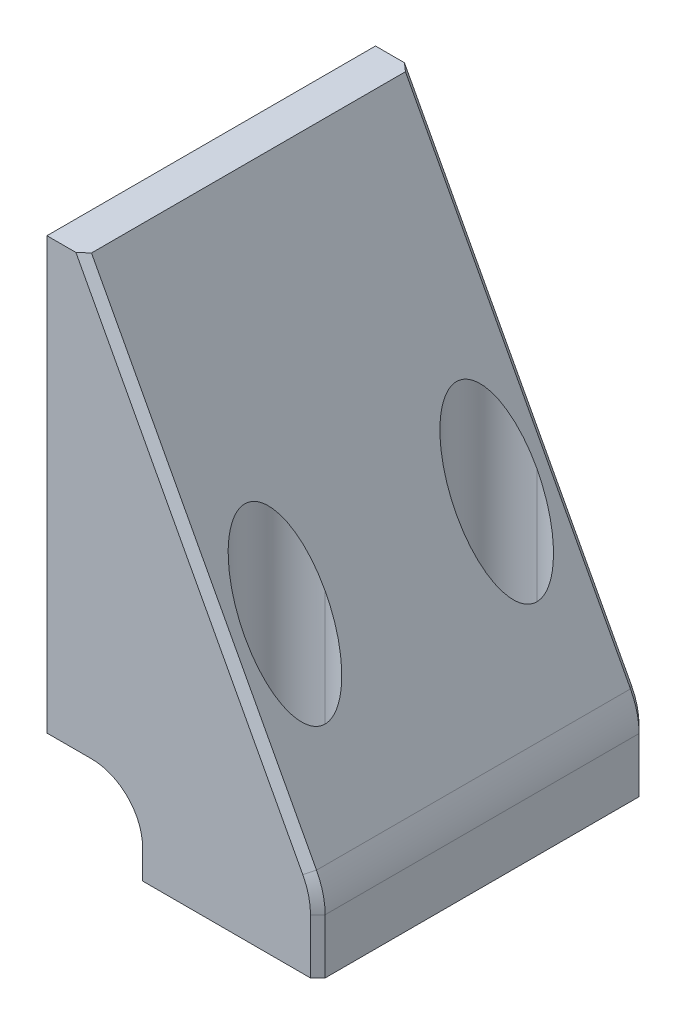
ISO-10303-21;
HEADER;
FILE_DESCRIPTION(('STEP AP214'),'2;1');
FILE_NAME('part.step','',(''),(''),'','','');
FILE_SCHEMA(('AUTOMOTIVE_DESIGN { 1 0 10303 214 1 1 1 1 }'));
ENDSEC;
DATA;
#1=APPLICATION_CONTEXT('core data for automotive mechanical design processes');
#2=APPLICATION_PROTOCOL_DEFINITION('international standard','automotive_design',2000,#1);
#3=PRODUCT_CONTEXT('',#1,'mechanical');
#4=PRODUCT('Part','Part','',(#3));
#5=PRODUCT_RELATED_PRODUCT_CATEGORY('part','',(#4));
#6=PRODUCT_DEFINITION_FORMATION('','',#4);
#7=PRODUCT_DEFINITION_CONTEXT('part definition',#1,'design');
#8=PRODUCT_DEFINITION('design','',#6,#7);
#9=PRODUCT_DEFINITION_SHAPE('','',#8);
#10=(LENGTH_UNIT() NAMED_UNIT(*) SI_UNIT(.MILLI.,.METRE.));
#11=(NAMED_UNIT(*) PLANE_ANGLE_UNIT() SI_UNIT($,.RADIAN.));
#12=(NAMED_UNIT(*) SI_UNIT($,.STERADIAN.) SOLID_ANGLE_UNIT());
#13=UNCERTAINTY_MEASURE_WITH_UNIT(LENGTH_MEASURE(1.E-05),#10,'distance_accuracy_value','');
#14=(GEOMETRIC_REPRESENTATION_CONTEXT(3) GLOBAL_UNCERTAINTY_ASSIGNED_CONTEXT((#13)) GLOBAL_UNIT_ASSIGNED_CONTEXT((#10,
#11,#12)) REPRESENTATION_CONTEXT('',''));
#15=CARTESIAN_POINT('',(0.,0.,0.));
#16=DIRECTION('',(0.,0.,1.));
#17=DIRECTION('',(1.,0.,0.));
#18=AXIS2_PLACEMENT_3D('',#15,#16,#17);
#19=CARTESIAN_POINT('',(0.,0.,7.25));
#20=DIRECTION('',(0.,-1.,0.));
#21=DIRECTION('',(0.,0.,-1.));
#22=AXIS2_PLACEMENT_3D('',#19,#20,#21);
#23=CONICAL_SURFACE('',#22,1.85,0.78539816339745);
#24=DIRECTION('',(0.,-0.707106781186546,0.707106781186549));
#25=VECTOR('',#24,1.);
#26=CARTESIAN_POINT('',(0.,0.,9.1));
#27=LINE('',#26,#25);
#28=CARTESIAN_POINT('',(0.,0.499999999999987,8.6));
#29=VERTEX_POINT('',#28);
#30=CARTESIAN_POINT('',(0.,0.,9.1));
#31=VERTEX_POINT('',#30);
#32=EDGE_CURVE('E284',#29,#31,#27,.T.);
#33=ORIENTED_EDGE('',*,*,#32,.F.);
#34=CARTESIAN_POINT('',(0.,0.499999999999987,7.25));
#35=DIRECTION('',(0.,-1.,0.));
#36=DIRECTION('',(0.,0.,1.));
#37=AXIS2_PLACEMENT_3D('',#34,#35,#36);
#38=CIRCLE('',#37,1.35);
#39=CARTESIAN_POINT('',(0.,0.499999999999987,5.9));
#40=VERTEX_POINT('',#39);
#41=EDGE_CURVE('E258',#40,#29,#38,.T.);
#42=ORIENTED_EDGE('',*,*,#41,.F.);
#43=DIRECTION('',(0.,-0.707106781186546,-0.707106781186549));
#44=VECTOR('',#43,1.);
#45=CARTESIAN_POINT('',(0.,0.,5.4));
#46=LINE('',#45,#44);
#47=CARTESIAN_POINT('',(0.,0.,5.4));
#48=VERTEX_POINT('',#47);
#49=EDGE_CURVE('E293',#40,#48,#46,.T.);
#50=ORIENTED_EDGE('',*,*,#49,.T.);
#51=CARTESIAN_POINT('',(0.,0.,7.25));
#52=DIRECTION('',(0.,1.,0.));
#53=DIRECTION('',(0.,0.,1.));
#54=AXIS2_PLACEMENT_3D('',#51,#52,#53);
#55=CIRCLE('',#54,1.85);
#56=EDGE_CURVE('E285',#31,#48,#55,.T.);
#57=ORIENTED_EDGE('',*,*,#56,.F.);
#58=EDGE_LOOP('',(#33,#42,#50,#57));
#59=FACE_BOUND('',#58,.T.);
#60=ADVANCED_FACE('F17',(#59),#23,.F.);
#61=CARTESIAN_POINT('',(0.,0.,-7.25));
#62=DIRECTION('',(0.,-1.,0.));
#63=DIRECTION('',(0.,0.,-1.));
#64=AXIS2_PLACEMENT_3D('',#61,#62,#63);
#65=CONICAL_SURFACE('',#64,1.85,0.785398163397449);
#66=DIRECTION('',(0.,-0.707106781186547,0.707106781186548));
#67=VECTOR('',#66,1.);
#68=CARTESIAN_POINT('',(0.,0.,-5.4));
#69=LINE('',#68,#67);
#70=CARTESIAN_POINT('',(0.,0.499999999999994,-5.9));
#71=VERTEX_POINT('',#70);
#72=CARTESIAN_POINT('',(0.,0.,-5.4));
#73=VERTEX_POINT('',#72);
#74=EDGE_CURVE('E318',#71,#73,#69,.T.);
#75=ORIENTED_EDGE('',*,*,#74,.F.);
#76=CARTESIAN_POINT('',(0.,0.499999999999994,-7.25));
#77=DIRECTION('',(0.,-1.,0.));
#78=DIRECTION('',(0.,0.,1.));
#79=AXIS2_PLACEMENT_3D('',#76,#77,#78);
#80=CIRCLE('',#79,1.35);
#81=CARTESIAN_POINT('',(0.,0.499999999999994,-8.6));
#82=VERTEX_POINT('',#81);
#83=EDGE_CURVE('E588',#82,#71,#80,.T.);
#84=ORIENTED_EDGE('',*,*,#83,.F.);
#85=DIRECTION('',(0.,-0.707106781186547,-0.707106781186548));
#86=VECTOR('',#85,1.);
#87=CARTESIAN_POINT('',(0.,0.,-9.1));
#88=LINE('',#87,#86);
#89=CARTESIAN_POINT('',(0.,0.,-9.1));
#90=VERTEX_POINT('',#89);
#91=EDGE_CURVE('E349',#82,#90,#88,.T.);
#92=ORIENTED_EDGE('',*,*,#91,.T.);
#93=CARTESIAN_POINT('',(0.,0.,-7.25));
#94=DIRECTION('',(0.,1.,0.));
#95=DIRECTION('',(0.,0.,1.));
#96=AXIS2_PLACEMENT_3D('',#93,#94,#95);
#97=CIRCLE('',#96,1.85);
#98=EDGE_CURVE('E479',#73,#90,#97,.T.);
#99=ORIENTED_EDGE('',*,*,#98,.F.);
#100=EDGE_LOOP('',(#75,#84,#92,#99));
#101=FACE_BOUND('',#100,.T.);
#102=ADVANCED_FACE('F696',(#101),#65,.F.);
#103=CARTESIAN_POINT('',(6.50086505190305,3.46712802768161,-11.25));
#104=DIRECTION('',(-0.623917748105777,-0.332756132323079,0.707106781186549));
#105=DIRECTION('',(-0.470588235294116,0.882352941176472,0.));
#106=AXIS2_PLACEMENT_3D('',#103,#104,#105);
#107=PLANE('',#106);
#108=DIRECTION('',(-0.749837855365093,0.,-0.661621637086846));
#109=VECTOR('',#108,1.);
#110=CARTESIAN_POINT('',(-0.860894941634287,35.,-2.90667200732437));
#111=LINE('',#110,#109);
#112=CARTESIAN_POINT('',(-9.75,35.,-10.75));
#113=VERTEX_POINT('',#112);
#114=CARTESIAN_POINT('',(-10.3166666666667,35.,-11.25));
#115=VERTEX_POINT('',#114);
#116=EDGE_CURVE('E307',#113,#115,#111,.T.);
#117=ORIENTED_EDGE('',*,*,#116,.F.);
#118=DIRECTION('',(-0.470588235294116,0.882352941176472,0.));
#119=VECTOR('',#118,1.);
#120=CARTESIAN_POINT('',(-9.75,35.,-10.75));
#121=LINE('',#120,#119);
#122=CARTESIAN_POINT('',(5.66176470588236,6.10294117647043,-10.75));
#123=VERTEX_POINT('',#122);
#124=EDGE_CURVE('E338',#123,#113,#121,.T.);
#125=ORIENTED_EDGE('',*,*,#124,.F.);
#126=DIRECTION('',(-0.623917748105779,-0.33275613232308,-0.707106781186547));
#127=VECTOR('',#126,1.);
#128=CARTESIAN_POINT('',(5.66176470588236,6.10294117647043,-10.75));
#129=LINE('',#128,#127);
#130=CARTESIAN_POINT('',(5.22058823529412,5.86764705882337,-11.25));
#131=VERTEX_POINT('',#130);
#132=EDGE_CURVE('E11',#123,#131,#129,.T.);
#133=ORIENTED_EDGE('',*,*,#132,.T.);
#134=DIRECTION('',(0.470588235294116,-0.882352941176472,0.));
#135=VECTOR('',#134,1.);
#136=CARTESIAN_POINT('',(5.22058823529412,5.86764705882335,-11.25));
#137=LINE('',#136,#135);
#138=EDGE_CURVE('E556',#115,#131,#137,.T.);
#139=ORIENTED_EDGE('',*,*,#138,.F.);
#140=EDGE_LOOP('',(#117,#125,#133,#139));
#141=FACE_BOUND('',#140,.T.);
#142=ADVANCED_FACE('F630',(#141),#107,.F.);
#143=CARTESIAN_POINT('',(1.25,3.74999999999985,-11.25));
#144=DIRECTION('',(0.,0.,1.));
#145=DIRECTION('',(1.,0.,0.));
#146=AXIS2_PLACEMENT_3D('',#143,#144,#145);
#147=CONICAL_SURFACE('',#146,4.5,0.785398163397448);
#148=DIRECTION('',(-0.707106781186548,0.,-0.707106781186548));
#149=VECTOR('',#148,1.);
#150=CARTESIAN_POINT('',(6.25,3.74999999999985,-10.75));
#151=LINE('',#150,#149);
#152=CARTESIAN_POINT('',(6.25,3.74999999999985,-10.75));
#153=VERTEX_POINT('',#152);
#154=CARTESIAN_POINT('',(5.75,3.74999999999985,-11.25));
#155=VERTEX_POINT('',#154);
#156=EDGE_CURVE('E25',#153,#155,#151,.T.);
#157=ORIENTED_EDGE('',*,*,#156,.T.);
#158=CARTESIAN_POINT('',(1.25,3.74999999999985,-11.25));
#159=DIRECTION('',(0.,0.,-1.));
#160=DIRECTION('',(1.,0.,0.));
#161=AXIS2_PLACEMENT_3D('',#158,#159,#160);
#162=CIRCLE('',#161,4.5);
#163=EDGE_CURVE('E303',#131,#155,#162,.T.);
#164=ORIENTED_EDGE('',*,*,#163,.F.);
#165=ORIENTED_EDGE('',*,*,#132,.F.);
#166=CARTESIAN_POINT('',(1.25,3.74999999999985,-10.75));
#167=DIRECTION('',(0.,0.,1.));
#168=DIRECTION('',(1.,0.,0.));
#169=AXIS2_PLACEMENT_3D('',#166,#167,#168);
#170=CIRCLE('',#169,5.);
#171=EDGE_CURVE('E518',#153,#123,#170,.T.);
#172=ORIENTED_EDGE('',*,*,#171,.F.);
#173=EDGE_LOOP('',(#157,#164,#165,#172));
#174=FACE_BOUND('',#173,.T.);
#175=ADVANCED_FACE('F626',(#174),#147,.T.);
#176=CARTESIAN_POINT('',(6.25,0.,-10.75));
#177=DIRECTION('',(-0.707106781186548,0.,0.707106781186548));
#178=DIRECTION('',(0.,1.,0.));
#179=AXIS2_PLACEMENT_3D('',#176,#177,#178);
#180=PLANE('',#179);
#181=DIRECTION('',(0.707106781186548,0.,0.707106781186548));
#182=VECTOR('',#181,1.);
#183=CARTESIAN_POINT('',(6.25,0.,-10.75));
#184=LINE('',#183,#182);
#185=CARTESIAN_POINT('',(5.75,0.,-11.25));
#186=VERTEX_POINT('',#185);
#187=CARTESIAN_POINT('',(6.25,0.,-10.75));
#188=VERTEX_POINT('',#187);
#189=EDGE_CURVE('E467',#186,#188,#184,.T.);
#190=ORIENTED_EDGE('',*,*,#189,.F.);
#191=DIRECTION('',(0.,-1.,0.));
#192=VECTOR('',#191,1.);
#193=CARTESIAN_POINT('',(5.75,0.,-11.25));
#194=LINE('',#193,#192);
#195=EDGE_CURVE('E300',#155,#186,#194,.T.);
#196=ORIENTED_EDGE('',*,*,#195,.F.);
#197=ORIENTED_EDGE('',*,*,#156,.F.);
#198=DIRECTION('',(0.,1.,0.));
#199=VECTOR('',#198,1.);
#200=CARTESIAN_POINT('',(6.25,0.,-10.75));
#201=LINE('',#200,#199);
#202=EDGE_CURVE('E375',#188,#153,#201,.T.);
#203=ORIENTED_EDGE('',*,*,#202,.F.);
#204=EDGE_LOOP('',(#190,#196,#197,#203));
#205=FACE_BOUND('',#204,.T.);
#206=ADVANCED_FACE('F624',(#205),#180,.F.);
#207=CARTESIAN_POINT('',(6.50086505190305,3.46712802768161,11.25));
#208=DIRECTION('',(0.623917748105777,0.332756132323079,0.707106781186549));
#209=DIRECTION('',(0.470588235294116,-0.882352941176472,0.));
#210=AXIS2_PLACEMENT_3D('',#207,#208,#209);
#211=PLANE('',#210);
#212=DIRECTION('',(0.623917748105779,0.33275613232308,-0.707106781186547));
#213=VECTOR('',#212,1.);
#214=CARTESIAN_POINT('',(5.22058823529412,5.86764705882337,11.25));
#215=LINE('',#214,#213);
#216=CARTESIAN_POINT('',(5.22058823529412,5.86764705882337,11.25));
#217=VERTEX_POINT('',#216);
#218=CARTESIAN_POINT('',(5.66176470588236,6.10294117647043,10.75));
#219=VERTEX_POINT('',#218);
#220=EDGE_CURVE('E47',#217,#219,#215,.T.);
#221=ORIENTED_EDGE('',*,*,#220,.T.);
#222=DIRECTION('',(0.470588235294116,-0.882352941176472,0.));
#223=VECTOR('',#222,1.);
#224=CARTESIAN_POINT('',(-9.75,35.,10.75));
#225=LINE('',#224,#223);
#226=CARTESIAN_POINT('',(-9.75,35.,10.75));
#227=VERTEX_POINT('',#226);
#228=EDGE_CURVE('E339',#227,#219,#225,.T.);
#229=ORIENTED_EDGE('',*,*,#228,.F.);
#230=DIRECTION('',(0.749837855365093,0.,-0.661621637086846));
#231=VECTOR('',#230,1.);
#232=CARTESIAN_POINT('',(-0.860894941634287,35.,2.90667200732437));
#233=LINE('',#232,#231);
#234=CARTESIAN_POINT('',(-10.3166666666667,35.,11.25));
#235=VERTEX_POINT('',#234);
#236=EDGE_CURVE('E308',#235,#227,#233,.T.);
#237=ORIENTED_EDGE('',*,*,#236,.F.);
#238=DIRECTION('',(-0.470588235294116,0.882352941176472,0.));
#239=VECTOR('',#238,1.);
#240=CARTESIAN_POINT('',(6.50086505190305,3.46712802768161,11.25));
#241=LINE('',#240,#239);
#242=EDGE_CURVE('E419',#217,#235,#241,.T.);
#243=ORIENTED_EDGE('',*,*,#242,.F.);
#244=EDGE_LOOP('',(#221,#229,#237,#243));
#245=FACE_BOUND('',#244,.T.);
#246=ADVANCED_FACE('F635',(#245),#211,.T.);
#247=CARTESIAN_POINT('',(1.25,3.74999999999985,11.25));
#248=DIRECTION('',(0.,0.,-1.));
#249=DIRECTION('',(-1.,0.,0.));
#250=AXIS2_PLACEMENT_3D('',#247,#248,#249);
#251=CONICAL_SURFACE('',#250,4.5,0.785398163397448);
#252=DIRECTION('',(0.707106781186548,0.,-0.707106781186548));
#253=VECTOR('',#252,1.);
#254=CARTESIAN_POINT('',(5.75,3.74999999999985,11.25));
#255=LINE('',#254,#253);
#256=CARTESIAN_POINT('',(5.75,3.74999999999985,11.25));
#257=VERTEX_POINT('',#256);
#258=CARTESIAN_POINT('',(6.25,3.74999999999985,10.75));
#259=VERTEX_POINT('',#258);
#260=EDGE_CURVE('E509',#257,#259,#255,.T.);
#261=ORIENTED_EDGE('',*,*,#260,.T.);
#262=CARTESIAN_POINT('',(1.25,3.74999999999985,10.75));
#263=DIRECTION('',(0.,0.,-1.));
#264=DIRECTION('',(1.,0.,0.));
#265=AXIS2_PLACEMENT_3D('',#262,#263,#264);
#266=CIRCLE('',#265,5.);
#267=EDGE_CURVE('E514',#219,#259,#266,.T.);
#268=ORIENTED_EDGE('',*,*,#267,.F.);
#269=ORIENTED_EDGE('',*,*,#220,.F.);
#270=CARTESIAN_POINT('',(1.25,3.74999999999985,11.25));
#271=DIRECTION('',(0.,0.,1.));
#272=DIRECTION('',(1.,0.,0.));
#273=AXIS2_PLACEMENT_3D('',#270,#271,#272);
#274=CIRCLE('',#273,4.5);
#275=EDGE_CURVE('E423',#257,#217,#274,.T.);
#276=ORIENTED_EDGE('',*,*,#275,.F.);
#277=EDGE_LOOP('',(#261,#268,#269,#276));
#278=FACE_BOUND('',#277,.T.);
#279=ADVANCED_FACE('F610',(#278),#251,.T.);
#280=CARTESIAN_POINT('',(5.75,0.,11.25));
#281=DIRECTION('',(0.707106781186548,0.,0.707106781186548));
#282=DIRECTION('',(0.,-1.,0.));
#283=AXIS2_PLACEMENT_3D('',#280,#281,#282);
#284=PLANE('',#283);
#285=DIRECTION('',(-0.707106781186548,0.,0.707106781186548));
#286=VECTOR('',#285,1.);
#287=CARTESIAN_POINT('',(5.75,0.,11.25));
#288=LINE('',#287,#286);
#289=CARTESIAN_POINT('',(6.25,0.,10.75));
#290=VERTEX_POINT('',#289);
#291=CARTESIAN_POINT('',(5.75,0.,11.25));
#292=VERTEX_POINT('',#291);
#293=EDGE_CURVE('E475',#290,#292,#288,.T.);
#294=ORIENTED_EDGE('',*,*,#293,.F.);
#295=DIRECTION('',(0.,-1.,0.));
#296=VECTOR('',#295,1.);
#297=CARTESIAN_POINT('',(6.25,0.,10.75));
#298=LINE('',#297,#296);
#299=EDGE_CURVE('E501',#259,#290,#298,.T.);
#300=ORIENTED_EDGE('',*,*,#299,.F.);
#301=ORIENTED_EDGE('',*,*,#260,.F.);
#302=DIRECTION('',(0.,1.,0.));
#303=VECTOR('',#302,1.);
#304=CARTESIAN_POINT('',(5.75,3.74999999999985,11.25));
#305=LINE('',#304,#303);
#306=EDGE_CURVE('E400',#292,#257,#305,.T.);
#307=ORIENTED_EDGE('',*,*,#306,.F.);
#308=EDGE_LOOP('',(#294,#300,#301,#307));
#309=FACE_BOUND('',#308,.T.);
#310=ADVANCED_FACE('F618',(#309),#284,.T.);
#311=CARTESIAN_POINT('',(-6.25,5.,-10.75));
#312=DIRECTION('',(0.,0.707106781186548,0.707106781186548));
#313=DIRECTION('',(1.,0.,0.));
#314=AXIS2_PLACEMENT_3D('',#311,#312,#313);
#315=PLANE('',#314);
#316=DIRECTION('',(0.,-0.707106781186548,0.707106781186548));
#317=VECTOR('',#316,1.);
#318=CARTESIAN_POINT('',(-12.3,5.,-10.75));
#319=LINE('',#318,#317);
#320=CARTESIAN_POINT('',(-12.3,5.5,-11.25));
#321=VERTEX_POINT('',#320);
#322=CARTESIAN_POINT('',(-12.3,5.,-10.75));
#323=VERTEX_POINT('',#322);
#324=EDGE_CURVE('E452',#321,#323,#319,.T.);
#325=ORIENTED_EDGE('',*,*,#324,.F.);
#326=DIRECTION('',(-1.,0.,0.));
#327=VECTOR('',#326,1.);
#328=CARTESIAN_POINT('',(0.,5.5,-11.25));
#329=LINE('',#328,#327);
#330=CARTESIAN_POINT('',(-9.25,5.5,-11.25));
#331=VERTEX_POINT('',#330);
#332=EDGE_CURVE('E553',#331,#321,#329,.T.);
#333=ORIENTED_EDGE('',*,*,#332,.F.);
#334=DIRECTION('',(0.,-0.707106781186548,0.707106781186548));
#335=VECTOR('',#334,1.);
#336=CARTESIAN_POINT('',(-9.25,5.5,-11.25));
#337=LINE('',#336,#335);
#338=CARTESIAN_POINT('',(-9.25,5.,-10.75));
#339=VERTEX_POINT('',#338);
#340=EDGE_CURVE('E580',#331,#339,#337,.T.);
#341=ORIENTED_EDGE('',*,*,#340,.T.);
#342=DIRECTION('',(1.,0.,0.));
#343=VECTOR('',#342,1.);
#344=CARTESIAN_POINT('',(-6.25,5.,-10.75));
#345=LINE('',#344,#343);
#346=EDGE_CURVE('E345',#323,#339,#345,.T.);
#347=ORIENTED_EDGE('',*,*,#346,.F.);
#348=EDGE_LOOP('',(#325,#333,#341,#347));
#349=FACE_BOUND('',#348,.T.);
#350=ADVANCED_FACE('F684',(#349),#315,.F.);
#351=CARTESIAN_POINT('',(-9.25,2.,-11.25));
#352=DIRECTION('',(0.,0.,-1.));
#353=DIRECTION('',(-1.,0.,0.));
#354=AXIS2_PLACEMENT_3D('',#351,#352,#353);
#355=CONICAL_SURFACE('',#354,3.5,0.785398163397448);
#356=DIRECTION('',(-0.707106781186548,0.,0.707106781186548));
#357=VECTOR('',#356,1.);
#358=CARTESIAN_POINT('',(-5.75,2.,-11.25));
#359=LINE('',#358,#357);
#360=CARTESIAN_POINT('',(-5.75,2.,-11.25));
#361=VERTEX_POINT('',#360);
#362=CARTESIAN_POINT('',(-6.25,2.,-10.75));
#363=VERTEX_POINT('',#362);
#364=EDGE_CURVE('E446',#361,#363,#359,.T.);
#365=ORIENTED_EDGE('',*,*,#364,.T.);
#366=CARTESIAN_POINT('',(-9.25,2.,-10.75));
#367=DIRECTION('',(0.,0.,-1.));
#368=DIRECTION('',(1.,0.,0.));
#369=AXIS2_PLACEMENT_3D('',#366,#367,#368);
#370=CIRCLE('',#369,3.);
#371=EDGE_CURVE('E584',#339,#363,#370,.T.);
#372=ORIENTED_EDGE('',*,*,#371,.F.);
#373=ORIENTED_EDGE('',*,*,#340,.F.);
#374=CARTESIAN_POINT('',(-9.25,2.,-11.25));
#375=DIRECTION('',(0.,0.,1.));
#376=DIRECTION('',(1.,0.,0.));
#377=AXIS2_PLACEMENT_3D('',#374,#375,#376);
#378=CIRCLE('',#377,3.5);
#379=EDGE_CURVE('E422',#361,#331,#378,.T.);
#380=ORIENTED_EDGE('',*,*,#379,.F.);
#381=EDGE_LOOP('',(#365,#372,#373,#380));
#382=FACE_BOUND('',#381,.T.);
#383=ADVANCED_FACE('F677',(#382),#355,.F.);
#384=CARTESIAN_POINT('',(-6.25,0.,-10.75));
#385=DIRECTION('',(0.707106781186548,0.,0.707106781186548));
#386=DIRECTION('',(0.,-1.,0.));
#387=AXIS2_PLACEMENT_3D('',#384,#385,#386);
#388=PLANE('',#387);
#389=DIRECTION('',(0.707106781186548,0.,-0.707106781186548));
#390=VECTOR('',#389,1.);
#391=CARTESIAN_POINT('',(-6.25,0.,-10.75));
#392=LINE('',#391,#390);
#393=CARTESIAN_POINT('',(-6.25,0.,-10.75));
#394=VERTEX_POINT('',#393);
#395=CARTESIAN_POINT('',(-5.75,0.,-11.25));
#396=VERTEX_POINT('',#395);
#397=EDGE_CURVE('E459',#394,#396,#392,.T.);
#398=ORIENTED_EDGE('',*,*,#397,.F.);
#399=DIRECTION('',(0.,-1.,0.));
#400=VECTOR('',#399,1.);
#401=CARTESIAN_POINT('',(-6.25,0.,-10.75));
#402=LINE('',#401,#400);
#403=EDGE_CURVE('E383',#363,#394,#402,.T.);
#404=ORIENTED_EDGE('',*,*,#403,.F.);
#405=ORIENTED_EDGE('',*,*,#364,.F.);
#406=DIRECTION('',(0.,1.,0.));
#407=VECTOR('',#406,1.);
#408=CARTESIAN_POINT('',(-5.75,0.,-11.25));
#409=LINE('',#408,#407);
#410=EDGE_CURVE('E302',#396,#361,#409,.T.);
#411=ORIENTED_EDGE('',*,*,#410,.F.);
#412=EDGE_LOOP('',(#398,#404,#405,#411));
#413=FACE_BOUND('',#412,.T.);
#414=ADVANCED_FACE('F674',(#413),#388,.F.);
#415=CARTESIAN_POINT('',(0.,5.5,11.25));
#416=DIRECTION('',(0.,-0.707106781186548,0.707106781186548));
#417=DIRECTION('',(-1.,0.,0.));
#418=AXIS2_PLACEMENT_3D('',#415,#416,#417);
#419=PLANE('',#418);
#420=DIRECTION('',(0.,0.707106781186548,0.707106781186548));
#421=VECTOR('',#420,1.);
#422=CARTESIAN_POINT('',(-12.3,5.5,11.25));
#423=LINE('',#422,#421);
#424=CARTESIAN_POINT('',(-12.3,5.,10.75));
#425=VERTEX_POINT('',#424);
#426=CARTESIAN_POINT('',(-12.3,5.5,11.25));
#427=VERTEX_POINT('',#426);
#428=EDGE_CURVE('E393',#425,#427,#423,.T.);
#429=ORIENTED_EDGE('',*,*,#428,.F.);
#430=DIRECTION('',(-1.,0.,0.));
#431=VECTOR('',#430,1.);
#432=CARTESIAN_POINT('',(-12.3,5.,10.75));
#433=LINE('',#432,#431);
#434=CARTESIAN_POINT('',(-9.25,5.,10.75));
#435=VERTEX_POINT('',#434);
#436=EDGE_CURVE('E535',#435,#425,#433,.T.);
#437=ORIENTED_EDGE('',*,*,#436,.F.);
#438=DIRECTION('',(0.,0.707106781186547,0.707106781186548));
#439=VECTOR('',#438,1.);
#440=CARTESIAN_POINT('',(-9.25,5.,10.75));
#441=LINE('',#440,#439);
#442=CARTESIAN_POINT('',(-9.25,5.5,11.25));
#443=VERTEX_POINT('',#442);
#444=EDGE_CURVE('E443',#435,#443,#441,.T.);
#445=ORIENTED_EDGE('',*,*,#444,.T.);
#446=DIRECTION('',(1.,0.,0.));
#447=VECTOR('',#446,1.);
#448=CARTESIAN_POINT('',(-9.25,5.5,11.25));
#449=LINE('',#448,#447);
#450=EDGE_CURVE('E340',#427,#443,#449,.T.);
#451=ORIENTED_EDGE('',*,*,#450,.F.);
#452=EDGE_LOOP('',(#429,#437,#445,#451));
#453=FACE_BOUND('',#452,.T.);
#454=ADVANCED_FACE('F658',(#453),#419,.T.);
#455=CARTESIAN_POINT('',(-9.25,2.,11.25));
#456=DIRECTION('',(0.,0.,1.));
#457=DIRECTION('',(1.,0.,0.));
#458=AXIS2_PLACEMENT_3D('',#455,#456,#457);
#459=CONICAL_SURFACE('',#458,3.5,0.785398163397448);
#460=DIRECTION('',(0.707106781186548,0.,0.707106781186548));
#461=VECTOR('',#460,1.);
#462=CARTESIAN_POINT('',(-6.25,2.,10.75));
#463=LINE('',#462,#461);
#464=CARTESIAN_POINT('',(-6.25,2.,10.75));
#465=VERTEX_POINT('',#464);
#466=CARTESIAN_POINT('',(-5.75,2.,11.25));
#467=VERTEX_POINT('',#466);
#468=EDGE_CURVE('E447',#465,#467,#463,.T.);
#469=ORIENTED_EDGE('',*,*,#468,.T.);
#470=CARTESIAN_POINT('',(-9.25,2.,11.25));
#471=DIRECTION('',(0.,0.,-1.));
#472=DIRECTION('',(1.,0.,0.));
#473=AXIS2_PLACEMENT_3D('',#470,#471,#472);
#474=CIRCLE('',#473,3.5);
#475=EDGE_CURVE('E344',#443,#467,#474,.T.);
#476=ORIENTED_EDGE('',*,*,#475,.F.);
#477=ORIENTED_EDGE('',*,*,#444,.F.);
#478=CARTESIAN_POINT('',(-9.25,2.,10.75));
#479=DIRECTION('',(0.,0.,1.));
#480=DIRECTION('',(1.,0.,0.));
#481=AXIS2_PLACEMENT_3D('',#478,#479,#480);
#482=CIRCLE('',#481,3.);
#483=EDGE_CURVE('E490',#465,#435,#482,.T.);
#484=ORIENTED_EDGE('',*,*,#483,.F.);
#485=EDGE_LOOP('',(#469,#476,#477,#484));
#486=FACE_BOUND('',#485,.T.);
#487=ADVANCED_FACE('F663',(#486),#459,.F.);
#488=CARTESIAN_POINT('',(-5.75,0.,11.25));
#489=DIRECTION('',(-0.707106781186548,0.,0.707106781186548));
#490=DIRECTION('',(0.,1.,0.));
#491=AXIS2_PLACEMENT_3D('',#488,#489,#490);
#492=PLANE('',#491);
#493=DIRECTION('',(-0.707106781186548,0.,-0.707106781186548));
#494=VECTOR('',#493,1.);
#495=CARTESIAN_POINT('',(-5.75,0.,11.25));
#496=LINE('',#495,#494);
#497=CARTESIAN_POINT('',(-5.75,0.,11.25));
#498=VERTEX_POINT('',#497);
#499=CARTESIAN_POINT('',(-6.25,0.,10.75));
#500=VERTEX_POINT('',#499);
#501=EDGE_CURVE('E451',#498,#500,#496,.T.);
#502=ORIENTED_EDGE('',*,*,#501,.F.);
#503=DIRECTION('',(0.,-1.,0.));
#504=VECTOR('',#503,1.);
#505=CARTESIAN_POINT('',(-5.75,0.,11.25));
#506=LINE('',#505,#504);
#507=EDGE_CURVE('E398',#467,#498,#506,.T.);
#508=ORIENTED_EDGE('',*,*,#507,.F.);
#509=ORIENTED_EDGE('',*,*,#468,.F.);
#510=DIRECTION('',(0.,1.,0.));
#511=VECTOR('',#510,1.);
#512=CARTESIAN_POINT('',(-6.25,2.,10.75));
#513=LINE('',#512,#511);
#514=EDGE_CURVE('E384',#500,#465,#513,.T.);
#515=ORIENTED_EDGE('',*,*,#514,.F.);
#516=EDGE_LOOP('',(#502,#508,#509,#515));
#517=FACE_BOUND('',#516,.T.);
#518=ADVANCED_FACE('F668',(#517),#492,.T.);
#519=CARTESIAN_POINT('',(1.25,3.74999999999985,11.25));
#520=DIRECTION('',(0.,0.,1.));
#521=DIRECTION('',(1.,0.,0.));
#522=AXIS2_PLACEMENT_3D('',#519,#520,#521);
#523=CYLINDRICAL_SURFACE('',#522,5.);
#524=DIRECTION('',(0.,0.,-1.));
#525=VECTOR('',#524,1.);
#526=CARTESIAN_POINT('',(5.66176470588236,6.10294117647043,-11.25));
#527=LINE('',#526,#525);
#528=EDGE_CURVE('E334',#219,#123,#527,.T.);
#529=ORIENTED_EDGE('',*,*,#528,.F.);
#530=ORIENTED_EDGE('',*,*,#267,.T.);
#531=DIRECTION('',(0.,0.,1.));
#532=VECTOR('',#531,1.);
#533=CARTESIAN_POINT('',(6.25,3.74999999999985,11.25));
#534=LINE('',#533,#532);
#535=EDGE_CURVE('E484',#153,#259,#534,.T.);
#536=ORIENTED_EDGE('',*,*,#535,.F.);
#537=ORIENTED_EDGE('',*,*,#171,.T.);
#538=EDGE_LOOP('',(#529,#530,#536,#537));
#539=FACE_BOUND('',#538,.T.);
#540=ADVANCED_FACE('F616',(#539),#523,.T.);
#541=CARTESIAN_POINT('',(0.,35.,7.25));
#542=DIRECTION('',(0.,1.,0.));
#543=DIRECTION('',(0.,0.,1.));
#544=AXIS2_PLACEMENT_3D('',#541,#542,#543);
#545=CYLINDRICAL_SURFACE('',#544,2.75);
#546=DIRECTION('',(0.,1.,0.));
#547=VECTOR('',#546,1.);
#548=CARTESIAN_POINT('',(0.,35.,4.5));
#549=LINE('',#548,#547);
#550=CARTESIAN_POINT('',(0.,3.,4.5));
#551=VERTEX_POINT('',#550);
#552=CARTESIAN_POINT('',(0.,16.71875,4.5));
#553=VERTEX_POINT('',#552);
#554=EDGE_CURVE('E326',#551,#553,#549,.T.);
#555=ORIENTED_EDGE('',*,*,#554,.F.);
#556=CARTESIAN_POINT('',(0.,3.,7.25));
#557=DIRECTION('',(0.,1.,0.));
#558=DIRECTION('',(0.,0.,1.));
#559=AXIS2_PLACEMENT_3D('',#556,#557,#558);
#560=CIRCLE('',#559,2.75);
#561=CARTESIAN_POINT('',(0.,3.,10.));
#562=VERTEX_POINT('',#561);
#563=EDGE_CURVE('E519',#562,#551,#560,.T.);
#564=ORIENTED_EDGE('',*,*,#563,.F.);
#565=DIRECTION('',(0.,1.,0.));
#566=VECTOR('',#565,1.);
#567=CARTESIAN_POINT('',(0.,35.,10.));
#568=LINE('',#567,#566);
#569=CARTESIAN_POINT('',(0.,16.71875,10.));
#570=VERTEX_POINT('',#569);
#571=EDGE_CURVE('E325',#562,#570,#568,.T.);
#572=ORIENTED_EDGE('',*,*,#571,.T.);
#573=CARTESIAN_POINT('',(0.,16.71875,10.));
#574=CARTESIAN_POINT('',(5.49999999999999,6.40624999999987,9.99999999999998));
#575=CARTESIAN_POINT('',(5.49999999999999,6.40624999999987,4.5));
#576=CARTESIAN_POINT('',(0.,16.71875,4.5));
#577=(BOUNDED_CURVE() B_SPLINE_CURVE(3,(#573,#574,#575,#576),.UNSPECIFIED.,.F.,
.F.) B_SPLINE_CURVE_WITH_KNOTS((4,4),(1.5707963267949,4.71238898038469),
.UNSPECIFIED.) CURVE() GEOMETRIC_REPRESENTATION_ITEM() RATIONAL_B_SPLINE_CURVE((1.,
0.333333333333334,0.333333333333334,1.)) REPRESENTATION_ITEM(''));
#578=EDGE_CURVE('E491',#570,#553,#577,.T.);
#579=ORIENTED_EDGE('',*,*,#578,.T.);
#580=EDGE_LOOP('',(#555,#564,#572,#579));
#581=FACE_BOUND('',#580,.T.);
#582=ADVANCED_FACE('F787',(#581),#545,.F.);
#583=CARTESIAN_POINT('',(1.34999999999999,3.,7.25));
#584=DIRECTION('',(0.,-1.,0.));
#585=DIRECTION('',(0.,0.,-1.));
#586=AXIS2_PLACEMENT_3D('',#583,#584,#585);
#587=PLANE('',#586);
#588=CARTESIAN_POINT('',(0.,3.,7.25));
#589=DIRECTION('',(0.,1.,0.));
#590=DIRECTION('',(0.,0.,1.));
#591=AXIS2_PLACEMENT_3D('',#588,#589,#590);
#592=CIRCLE('',#591,1.35);
#593=CARTESIAN_POINT('',(0.,3.,8.6));
#594=VERTEX_POINT('',#593);
#595=CARTESIAN_POINT('',(0.,3.,5.9));
#596=VERTEX_POINT('',#595);
#597=EDGE_CURVE('E270',#594,#596,#592,.T.);
#598=ORIENTED_EDGE('',*,*,#597,.F.);
#599=CARTESIAN_POINT('',(0.,3.,7.25));
#600=DIRECTION('',(0.,1.,0.));
#601=DIRECTION('',(0.,0.,1.));
#602=AXIS2_PLACEMENT_3D('',#599,#600,#601);
#603=CIRCLE('',#602,1.35);
#604=EDGE_CURVE('E279',#596,#594,#603,.T.);
#605=ORIENTED_EDGE('',*,*,#604,.F.);
#606=EDGE_LOOP('',(#598,#605));
#607=FACE_BOUND('',#606,.T.);
#608=ORIENTED_EDGE('',*,*,#563,.T.);
#609=CARTESIAN_POINT('',(0.,3.,7.25));
#610=DIRECTION('',(0.,1.,0.));
#611=DIRECTION('',(0.,0.,1.));
#612=AXIS2_PLACEMENT_3D('',#609,#610,#611);
#613=CIRCLE('',#612,2.75);
#614=EDGE_CURVE('E353',#551,#562,#613,.T.);
#615=ORIENTED_EDGE('',*,*,#614,.T.);
#616=EDGE_LOOP('',(#608,#615));
#617=FACE_BOUND('',#616,.T.);
#618=ADVANCED_FACE('F798',(#607,#617),#587,.F.);
#619=CARTESIAN_POINT('',(0.,35.,7.25));
#620=DIRECTION('',(0.,1.,0.));
#621=DIRECTION('',(0.,0.,1.));
#622=AXIS2_PLACEMENT_3D('',#619,#620,#621);
#623=CYLINDRICAL_SURFACE('',#622,1.35);
#624=DIRECTION('',(0.,1.,0.));
#625=VECTOR('',#624,1.);
#626=CARTESIAN_POINT('',(0.,35.,5.9));
#627=LINE('',#626,#625);
#628=EDGE_CURVE('E264',#40,#596,#627,.T.);
#629=ORIENTED_EDGE('',*,*,#628,.F.);
#630=ORIENTED_EDGE('',*,*,#41,.T.);
#631=DIRECTION('',(0.,1.,0.));
#632=VECTOR('',#631,1.);
#633=CARTESIAN_POINT('',(0.,35.,8.6));
#634=LINE('',#633,#632);
#635=EDGE_CURVE('E261',#29,#594,#634,.T.);
#636=ORIENTED_EDGE('',*,*,#635,.T.);
#637=ORIENTED_EDGE('',*,*,#597,.T.);
#638=EDGE_LOOP('',(#629,#630,#636,#637));
#639=FACE_BOUND('',#638,.T.);
#640=ADVANCED_FACE('F260',(#639),#623,.F.);
#641=CARTESIAN_POINT('',(0.,35.,-7.25));
#642=DIRECTION('',(0.,1.,0.));
#643=DIRECTION('',(0.,0.,1.));
#644=AXIS2_PLACEMENT_3D('',#641,#642,#643);
#645=CYLINDRICAL_SURFACE('',#644,2.75);
#646=DIRECTION('',(0.,1.,0.));
#647=VECTOR('',#646,1.);
#648=CARTESIAN_POINT('',(0.,35.,-10.));
#649=LINE('',#648,#647);
#650=CARTESIAN_POINT('',(0.,3.,-10.));
#651=VERTEX_POINT('',#650);
#652=CARTESIAN_POINT('',(0.,16.71875,-10.));
#653=VERTEX_POINT('',#652);
#654=EDGE_CURVE('E361',#651,#653,#649,.T.);
#655=ORIENTED_EDGE('',*,*,#654,.F.);
#656=CARTESIAN_POINT('',(0.,3.,-7.25));
#657=DIRECTION('',(0.,1.,0.));
#658=DIRECTION('',(0.,0.,1.));
#659=AXIS2_PLACEMENT_3D('',#656,#657,#658);
#660=CIRCLE('',#659,2.75);
#661=CARTESIAN_POINT('',(0.,3.,-4.5));
#662=VERTEX_POINT('',#661);
#663=EDGE_CURVE('E271',#662,#651,#660,.T.);
#664=ORIENTED_EDGE('',*,*,#663,.F.);
#665=DIRECTION('',(0.,1.,0.));
#666=VECTOR('',#665,1.);
#667=CARTESIAN_POINT('',(0.,35.,-4.5));
#668=LINE('',#667,#666);
#669=CARTESIAN_POINT('',(0.,16.71875,-4.5));
#670=VERTEX_POINT('',#669);
#671=EDGE_CURVE('E360',#662,#670,#668,.T.);
#672=ORIENTED_EDGE('',*,*,#671,.T.);
#673=CARTESIAN_POINT('',(0.,16.71875,-4.5));
#674=CARTESIAN_POINT('',(5.49999999999999,6.40624999999987,-4.5));
#675=CARTESIAN_POINT('',(5.49999999999999,6.40624999999987,-9.99999999999998));
#676=CARTESIAN_POINT('',(0.,16.71875,-10.));
#677=(BOUNDED_CURVE() B_SPLINE_CURVE(3,(#673,#674,#675,#676),.UNSPECIFIED.,.F.,
.F.) B_SPLINE_CURVE_WITH_KNOTS((4,4),(1.5707963267949,4.71238898038469),
.UNSPECIFIED.) CURVE() GEOMETRIC_REPRESENTATION_ITEM() RATIONAL_B_SPLINE_CURVE((1.,
0.333333333333334,0.333333333333334,1.)) REPRESENTATION_ITEM(''));
#678=EDGE_CURVE('E485',#670,#653,#677,.T.);
#679=ORIENTED_EDGE('',*,*,#678,.T.);
#680=EDGE_LOOP('',(#655,#664,#672,#679));
#681=FACE_BOUND('',#680,.T.);
#682=ADVANCED_FACE('F819',(#681),#645,.F.);
#683=CARTESIAN_POINT('',(1.34999999999998,3.,-7.25));
#684=DIRECTION('',(0.,-1.,0.));
#685=DIRECTION('',(0.,0.,-1.));
#686=AXIS2_PLACEMENT_3D('',#683,#684,#685);
#687=PLANE('',#686);
#688=CARTESIAN_POINT('',(0.,3.,-7.25));
#689=DIRECTION('',(0.,1.,0.));
#690=DIRECTION('',(0.,0.,1.));
#691=AXIS2_PLACEMENT_3D('',#688,#689,#690);
#692=CIRCLE('',#691,1.35);
#693=CARTESIAN_POINT('',(0.,3.,-5.9));
#694=VERTEX_POINT('',#693);
#695=CARTESIAN_POINT('',(0.,3.,-8.6));
#696=VERTEX_POINT('',#695);
#697=EDGE_CURVE('E591',#694,#696,#692,.T.);
#698=ORIENTED_EDGE('',*,*,#697,.F.);
#699=CARTESIAN_POINT('',(0.,3.,-7.25));
#700=DIRECTION('',(0.,1.,0.));
#701=DIRECTION('',(0.,0.,1.));
#702=AXIS2_PLACEMENT_3D('',#699,#700,#701);
#703=CIRCLE('',#702,1.35);
#704=EDGE_CURVE('E427',#696,#694,#703,.T.);
#705=ORIENTED_EDGE('',*,*,#704,.F.);
#706=EDGE_LOOP('',(#698,#705));
#707=FACE_BOUND('',#706,.T.);
#708=ORIENTED_EDGE('',*,*,#663,.T.);
#709=CARTESIAN_POINT('',(0.,3.,-7.25));
#710=DIRECTION('',(0.,1.,0.));
#711=DIRECTION('',(0.,0.,1.));
#712=AXIS2_PLACEMENT_3D('',#709,#710,#711);
#713=CIRCLE('',#712,2.75);
#714=EDGE_CURVE('E281',#651,#662,#713,.T.);
#715=ORIENTED_EDGE('',*,*,#714,.T.);
#716=EDGE_LOOP('',(#708,#715));
#717=FACE_BOUND('',#716,.T.);
#718=ADVANCED_FACE('F829',(#707,#717),#687,.F.);
#719=CARTESIAN_POINT('',(0.,35.,-7.25));
#720=DIRECTION('',(0.,1.,0.));
#721=DIRECTION('',(0.,0.,1.));
#722=AXIS2_PLACEMENT_3D('',#719,#720,#721);
#723=CYLINDRICAL_SURFACE('',#722,1.35);
#724=DIRECTION('',(0.,1.,0.));
#725=VECTOR('',#724,1.);
#726=CARTESIAN_POINT('',(0.,35.,-8.6));
#727=LINE('',#726,#725);
#728=EDGE_CURVE('E418',#82,#696,#727,.T.);
#729=ORIENTED_EDGE('',*,*,#728,.F.);
#730=ORIENTED_EDGE('',*,*,#83,.T.);
#731=DIRECTION('',(0.,1.,0.));
#732=VECTOR('',#731,1.);
#733=CARTESIAN_POINT('',(0.,35.,-5.9));
#734=LINE('',#733,#732);
#735=EDGE_CURVE('E414',#71,#694,#734,.T.);
#736=ORIENTED_EDGE('',*,*,#735,.T.);
#737=ORIENTED_EDGE('',*,*,#697,.T.);
#738=EDGE_LOOP('',(#729,#730,#736,#737));
#739=FACE_BOUND('',#738,.T.);
#740=ADVANCED_FACE('F840',(#739),#723,.F.);
#741=CARTESIAN_POINT('',(-9.25,2.,11.25));
#742=DIRECTION('',(0.,0.,1.));
#743=DIRECTION('',(1.,0.,0.));
#744=AXIS2_PLACEMENT_3D('',#741,#742,#743);
#745=CYLINDRICAL_SURFACE('',#744,3.);
#746=DIRECTION('',(0.,0.,-1.));
#747=VECTOR('',#746,1.);
#748=CARTESIAN_POINT('',(-6.25,2.,-11.25));
#749=LINE('',#748,#747);
#750=EDGE_CURVE('E379',#465,#363,#749,.T.);
#751=ORIENTED_EDGE('',*,*,#750,.F.);
#752=ORIENTED_EDGE('',*,*,#483,.T.);
#753=DIRECTION('',(0.,0.,1.));
#754=VECTOR('',#753,1.);
#755=CARTESIAN_POINT('',(-9.25,5.,11.25));
#756=LINE('',#755,#754);
#757=EDGE_CURVE('E456',#339,#435,#756,.T.);
#758=ORIENTED_EDGE('',*,*,#757,.F.);
#759=ORIENTED_EDGE('',*,*,#371,.T.);
#760=EDGE_LOOP('',(#751,#752,#758,#759));
#761=FACE_BOUND('',#760,.T.);
#762=ADVANCED_FACE('F680',(#761),#745,.F.);
#763=CARTESIAN_POINT('',(-9.75,35.,11.25));
#764=DIRECTION('',(-0.882352941176472,-0.470588235294116,0.));
#765=DIRECTION('',(-0.470588235294116,0.882352941176472,0.));
#766=AXIS2_PLACEMENT_3D('',#763,#764,#765);
#767=PLANE('',#766);
#768=ORIENTED_EDGE('',*,*,#678,.F.);
#769=CARTESIAN_POINT('',(0.,16.71875,-10.));
#770=CARTESIAN_POINT('',(-5.5,27.0312499999999,-10.));
#771=CARTESIAN_POINT('',(-5.5,27.0312499999999,-4.5));
#772=CARTESIAN_POINT('',(0.,16.71875,-4.5));
#773=(BOUNDED_CURVE() B_SPLINE_CURVE(3,(#769,#770,#771,#772),.UNSPECIFIED.,.F.,
.F.) B_SPLINE_CURVE_WITH_KNOTS((4,4),(4.71238898038469,7.85398163397448),
.UNSPECIFIED.) CURVE() GEOMETRIC_REPRESENTATION_ITEM() RATIONAL_B_SPLINE_CURVE((1.,
0.333333333333334,0.333333333333334,1.)) REPRESENTATION_ITEM(''));
#774=EDGE_CURVE('E354',#653,#670,#773,.T.);
#775=ORIENTED_EDGE('',*,*,#774,.F.);
#776=EDGE_LOOP('',(#768,#775));
#777=FACE_BOUND('',#776,.T.);
#778=ORIENTED_EDGE('',*,*,#578,.F.);
#779=CARTESIAN_POINT('',(0.,16.71875,4.5));
#780=CARTESIAN_POINT('',(-5.49999999999999,27.0312499999999,4.5));
#781=CARTESIAN_POINT('',(-5.49999999999999,27.0312499999999,9.99999999999998));
#782=CARTESIAN_POINT('',(0.,16.71875,10.));
#783=(BOUNDED_CURVE() B_SPLINE_CURVE(3,(#779,#780,#781,#782),.UNSPECIFIED.,.F.,
.F.) B_SPLINE_CURVE_WITH_KNOTS((4,4),(4.71238898038469,7.85398163397448),
.UNSPECIFIED.) CURVE() GEOMETRIC_REPRESENTATION_ITEM() RATIONAL_B_SPLINE_CURVE((1.,
0.333333333333334,0.333333333333334,1.)) REPRESENTATION_ITEM(''));
#784=EDGE_CURVE('E319',#553,#570,#783,.T.);
#785=ORIENTED_EDGE('',*,*,#784,.F.);
#786=EDGE_LOOP('',(#778,#785));
#787=FACE_BOUND('',#786,.T.);
#788=DIRECTION('',(0.,0.,-1.));
#789=VECTOR('',#788,1.);
#790=CARTESIAN_POINT('',(-9.75,35.,11.25));
#791=LINE('',#790,#789);
#792=EDGE_CURVE('E304',#227,#113,#791,.T.);
#793=ORIENTED_EDGE('',*,*,#792,.F.);
#794=ORIENTED_EDGE('',*,*,#228,.T.);
#795=ORIENTED_EDGE('',*,*,#528,.T.);
#796=ORIENTED_EDGE('',*,*,#124,.T.);
#797=EDGE_LOOP('',(#793,#794,#795,#796));
#798=FACE_BOUND('',#797,.T.);
#799=ADVANCED_FACE('F633',(#777,#787,#798),#767,.F.);
#800=CARTESIAN_POINT('',(0.,0.,-11.25));
#801=DIRECTION('',(0.,0.,1.));
#802=DIRECTION('',(1.,0.,0.));
#803=AXIS2_PLACEMENT_3D('',#800,#801,#802);
#804=PLANE('',#803);
#805=ORIENTED_EDGE('',*,*,#379,.T.);
#806=ORIENTED_EDGE('',*,*,#332,.T.);
#807=DIRECTION('',(0.,-1.,0.));
#808=VECTOR('',#807,1.);
#809=CARTESIAN_POINT('',(-12.3,35.,-11.25));
#810=LINE('',#809,#808);
#811=CARTESIAN_POINT('',(-12.3,35.,-11.25));
#812=VERTEX_POINT('',#811);
#813=EDGE_CURVE('E392',#812,#321,#810,.T.);
#814=ORIENTED_EDGE('',*,*,#813,.F.);
#815=DIRECTION('',(-1.,0.,0.));
#816=VECTOR('',#815,1.);
#817=CARTESIAN_POINT('',(6.25,35.,-11.25));
#818=LINE('',#817,#816);
#819=EDGE_CURVE('E513',#115,#812,#818,.T.);
#820=ORIENTED_EDGE('',*,*,#819,.F.);
#821=ORIENTED_EDGE('',*,*,#138,.T.);
#822=ORIENTED_EDGE('',*,*,#163,.T.);
#823=ORIENTED_EDGE('',*,*,#195,.T.);
#824=DIRECTION('',(1.,0.,0.));
#825=VECTOR('',#824,1.);
#826=CARTESIAN_POINT('',(-6.25,0.,-11.25));
#827=LINE('',#826,#825);
#828=EDGE_CURVE('E463',#396,#186,#827,.T.);
#829=ORIENTED_EDGE('',*,*,#828,.F.);
#830=ORIENTED_EDGE('',*,*,#410,.T.);
#831=EDGE_LOOP('',(#805,#806,#814,#820,#821,#822,#823,#829,#830));
#832=FACE_BOUND('',#831,.T.);
#833=ADVANCED_FACE('F647',(#832),#804,.F.);
#834=CARTESIAN_POINT('',(0.,0.,11.25));
#835=DIRECTION('',(0.,0.,1.));
#836=DIRECTION('',(1.,0.,0.));
#837=AXIS2_PLACEMENT_3D('',#834,#835,#836);
#838=PLANE('',#837);
#839=DIRECTION('',(0.,-1.,0.));
#840=VECTOR('',#839,1.);
#841=CARTESIAN_POINT('',(-12.3,35.,11.25));
#842=LINE('',#841,#840);
#843=CARTESIAN_POINT('',(-12.3,35.,11.25));
#844=VERTEX_POINT('',#843);
#845=EDGE_CURVE('E388',#844,#427,#842,.T.);
#846=ORIENTED_EDGE('',*,*,#845,.T.);
#847=ORIENTED_EDGE('',*,*,#450,.T.);
#848=ORIENTED_EDGE('',*,*,#475,.T.);
#849=ORIENTED_EDGE('',*,*,#507,.T.);
#850=DIRECTION('',(1.,0.,0.));
#851=VECTOR('',#850,1.);
#852=CARTESIAN_POINT('',(-6.25,0.,11.25));
#853=LINE('',#852,#851);
#854=EDGE_CURVE('E440',#498,#292,#853,.T.);
#855=ORIENTED_EDGE('',*,*,#854,.T.);
#856=ORIENTED_EDGE('',*,*,#306,.T.);
#857=ORIENTED_EDGE('',*,*,#275,.T.);
#858=ORIENTED_EDGE('',*,*,#242,.T.);
#859=DIRECTION('',(-1.,0.,0.));
#860=VECTOR('',#859,1.);
#861=CARTESIAN_POINT('',(6.25,35.,11.25));
#862=LINE('',#861,#860);
#863=EDGE_CURVE('E371',#235,#844,#862,.T.);
#864=ORIENTED_EDGE('',*,*,#863,.T.);
#865=EDGE_LOOP('',(#846,#847,#848,#849,#855,#856,#857,#858,#864));
#866=FACE_BOUND('',#865,.T.);
#867=ADVANCED_FACE('F641',(#866),#838,.T.);
#868=CARTESIAN_POINT('',(-6.25,5.,11.25));
#869=DIRECTION('',(0.,1.,0.));
#870=DIRECTION('',(1.,0.,0.));
#871=AXIS2_PLACEMENT_3D('',#868,#869,#870);
#872=PLANE('',#871);
#873=ORIENTED_EDGE('',*,*,#757,.T.);
#874=ORIENTED_EDGE('',*,*,#436,.T.);
#875=DIRECTION('',(0.,0.,-1.));
#876=VECTOR('',#875,1.);
#877=CARTESIAN_POINT('',(-12.3,5.,11.25));
#878=LINE('',#877,#876);
#879=EDGE_CURVE('E405',#425,#323,#878,.T.);
#880=ORIENTED_EDGE('',*,*,#879,.T.);
#881=ORIENTED_EDGE('',*,*,#346,.T.);
#882=EDGE_LOOP('',(#873,#874,#880,#881));
#883=FACE_BOUND('',#882,.T.);
#884=ADVANCED_FACE('F682',(#883),#872,.F.);
#885=CARTESIAN_POINT('',(-12.3,35.,11.25));
#886=DIRECTION('',(1.,0.,0.));
#887=DIRECTION('',(0.,1.,0.));
#888=AXIS2_PLACEMENT_3D('',#885,#886,#887);
#889=PLANE('',#888);
#890=ORIENTED_EDGE('',*,*,#879,.F.);
#891=ORIENTED_EDGE('',*,*,#428,.T.);
#892=ORIENTED_EDGE('',*,*,#845,.F.);
#893=DIRECTION('',(0.,0.,-1.));
#894=VECTOR('',#893,1.);
#895=CARTESIAN_POINT('',(-12.3,35.,11.25));
#896=LINE('',#895,#894);
#897=EDGE_CURVE('E409',#844,#812,#896,.T.);
#898=ORIENTED_EDGE('',*,*,#897,.T.);
#899=ORIENTED_EDGE('',*,*,#813,.T.);
#900=ORIENTED_EDGE('',*,*,#324,.T.);
#901=EDGE_LOOP('',(#890,#891,#892,#898,#899,#900));
#902=FACE_BOUND('',#901,.T.);
#903=ADVANCED_FACE('F654',(#902),#889,.F.);
#904=CARTESIAN_POINT('',(6.25,35.,11.25));
#905=DIRECTION('',(0.,-1.,0.));
#906=DIRECTION('',(0.,0.,-1.));
#907=AXIS2_PLACEMENT_3D('',#904,#905,#906);
#908=PLANE('',#907);
#909=ORIENTED_EDGE('',*,*,#863,.F.);
#910=ORIENTED_EDGE('',*,*,#236,.T.);
#911=ORIENTED_EDGE('',*,*,#792,.T.);
#912=ORIENTED_EDGE('',*,*,#116,.T.);
#913=ORIENTED_EDGE('',*,*,#819,.T.);
#914=ORIENTED_EDGE('',*,*,#897,.F.);
#915=EDGE_LOOP('',(#909,#910,#911,#912,#913,#914));
#916=FACE_BOUND('',#915,.T.);
#917=ADVANCED_FACE('F639',(#916),#908,.F.);
#918=CARTESIAN_POINT('',(6.25,0.,11.25));
#919=DIRECTION('',(-1.,0.,0.));
#920=DIRECTION('',(0.,0.,1.));
#921=AXIS2_PLACEMENT_3D('',#918,#919,#920);
#922=PLANE('',#921);
#923=ORIENTED_EDGE('',*,*,#535,.T.);
#924=ORIENTED_EDGE('',*,*,#299,.T.);
#925=DIRECTION('',(0.,0.,-1.));
#926=VECTOR('',#925,1.);
#927=CARTESIAN_POINT('',(6.25,0.,11.25));
#928=LINE('',#927,#926);
#929=EDGE_CURVE('E471',#290,#188,#928,.T.);
#930=ORIENTED_EDGE('',*,*,#929,.T.);
#931=ORIENTED_EDGE('',*,*,#202,.T.);
#932=EDGE_LOOP('',(#923,#924,#930,#931));
#933=FACE_BOUND('',#932,.T.);
#934=ADVANCED_FACE('F621',(#933),#922,.F.);
#935=CARTESIAN_POINT('',(-6.25,0.,11.25));
#936=DIRECTION('',(0.,1.,0.));
#937=DIRECTION('',(1.,0.,0.));
#938=AXIS2_PLACEMENT_3D('',#935,#936,#937);
#939=PLANE('',#938);
#940=CARTESIAN_POINT('',(0.,0.,7.25));
#941=DIRECTION('',(0.,1.,0.));
#942=DIRECTION('',(0.,0.,1.));
#943=AXIS2_PLACEMENT_3D('',#940,#941,#942);
#944=CIRCLE('',#943,1.85);
#945=EDGE_CURVE('E290',#48,#31,#944,.T.);
#946=ORIENTED_EDGE('',*,*,#945,.T.);
#947=ORIENTED_EDGE('',*,*,#56,.T.);
#948=EDGE_LOOP('',(#946,#947));
#949=FACE_BOUND('',#948,.T.);
#950=CARTESIAN_POINT('',(0.,0.,-7.25));
#951=DIRECTION('',(0.,1.,0.));
#952=DIRECTION('',(0.,0.,1.));
#953=AXIS2_PLACEMENT_3D('',#950,#951,#952);
#954=CIRCLE('',#953,1.85);
#955=EDGE_CURVE('E333',#90,#73,#954,.T.);
#956=ORIENTED_EDGE('',*,*,#955,.T.);
#957=ORIENTED_EDGE('',*,*,#98,.T.);
#958=EDGE_LOOP('',(#956,#957));
#959=FACE_BOUND('',#958,.T.);
#960=ORIENTED_EDGE('',*,*,#854,.F.);
#961=ORIENTED_EDGE('',*,*,#501,.T.);
#962=DIRECTION('',(0.,0.,-1.));
#963=VECTOR('',#962,1.);
#964=CARTESIAN_POINT('',(-6.25,0.,11.25));
#965=LINE('',#964,#963);
#966=EDGE_CURVE('E410',#500,#394,#965,.T.);
#967=ORIENTED_EDGE('',*,*,#966,.T.);
#968=ORIENTED_EDGE('',*,*,#397,.T.);
#969=ORIENTED_EDGE('',*,*,#828,.T.);
#970=ORIENTED_EDGE('',*,*,#189,.T.);
#971=ORIENTED_EDGE('',*,*,#929,.F.);
#972=ORIENTED_EDGE('',*,*,#293,.T.);
#973=EDGE_LOOP('',(#960,#961,#967,#968,#969,#970,#971,#972));
#974=FACE_BOUND('',#973,.T.);
#975=ADVANCED_FACE('F644',(#949,#959,#974),#939,.F.);
#976=CARTESIAN_POINT('',(-6.25,0.,11.25));
#977=DIRECTION('',(1.,0.,0.));
#978=DIRECTION('',(0.,1.,0.));
#979=AXIS2_PLACEMENT_3D('',#976,#977,#978);
#980=PLANE('',#979);
#981=ORIENTED_EDGE('',*,*,#966,.F.);
#982=ORIENTED_EDGE('',*,*,#514,.T.);
#983=ORIENTED_EDGE('',*,*,#750,.T.);
#984=ORIENTED_EDGE('',*,*,#403,.T.);
#985=EDGE_LOOP('',(#981,#982,#983,#984));
#986=FACE_BOUND('',#985,.T.);
#987=ADVANCED_FACE('F671',(#986),#980,.F.);
#988=CARTESIAN_POINT('',(0.,35.,-7.25));
#989=DIRECTION('',(0.,1.,0.));
#990=DIRECTION('',(0.,0.,1.));
#991=AXIS2_PLACEMENT_3D('',#988,#989,#990);
#992=CYLINDRICAL_SURFACE('',#991,1.35);
#993=CARTESIAN_POINT('',(0.,0.499999999999994,-7.25));
#994=DIRECTION('',(0.,-1.,0.));
#995=DIRECTION('',(0.,0.,1.));
#996=AXIS2_PLACEMENT_3D('',#993,#994,#995);
#997=CIRCLE('',#996,1.35);
#998=EDGE_CURVE('E314',#71,#82,#997,.T.);
#999=ORIENTED_EDGE('',*,*,#998,.T.);
#1000=ORIENTED_EDGE('',*,*,#728,.T.);
#1001=ORIENTED_EDGE('',*,*,#704,.T.);
#1002=ORIENTED_EDGE('',*,*,#735,.F.);
#1003=EDGE_LOOP('',(#999,#1000,#1001,#1002));
#1004=FACE_BOUND('',#1003,.T.);
#1005=ADVANCED_FACE('F947',(#1004),#992,.F.);
#1006=CARTESIAN_POINT('',(0.,35.,-7.25));
#1007=DIRECTION('',(0.,1.,0.));
#1008=DIRECTION('',(0.,0.,1.));
#1009=AXIS2_PLACEMENT_3D('',#1006,#1007,#1008);
#1010=CYLINDRICAL_SURFACE('',#1009,2.75);
#1011=ORIENTED_EDGE('',*,*,#714,.F.);
#1012=ORIENTED_EDGE('',*,*,#654,.T.);
#1013=ORIENTED_EDGE('',*,*,#774,.T.);
#1014=ORIENTED_EDGE('',*,*,#671,.F.);
#1015=EDGE_LOOP('',(#1011,#1012,#1013,#1014));
#1016=FACE_BOUND('',#1015,.T.);
#1017=ADVANCED_FACE('F956',(#1016),#1010,.F.);
#1018=CARTESIAN_POINT('',(0.,35.,7.25));
#1019=DIRECTION('',(0.,1.,0.));
#1020=DIRECTION('',(0.,0.,1.));
#1021=AXIS2_PLACEMENT_3D('',#1018,#1019,#1020);
#1022=CYLINDRICAL_SURFACE('',#1021,1.35);
#1023=CARTESIAN_POINT('',(0.,0.499999999999987,7.25));
#1024=DIRECTION('',(0.,-1.,0.));
#1025=DIRECTION('',(0.,0.,1.));
#1026=AXIS2_PLACEMENT_3D('',#1023,#1024,#1025);
#1027=CIRCLE('',#1026,1.35);
#1028=EDGE_CURVE('E277',#29,#40,#1027,.T.);
#1029=ORIENTED_EDGE('',*,*,#1028,.T.);
#1030=ORIENTED_EDGE('',*,*,#628,.T.);
#1031=ORIENTED_EDGE('',*,*,#604,.T.);
#1032=ORIENTED_EDGE('',*,*,#635,.F.);
#1033=EDGE_LOOP('',(#1029,#1030,#1031,#1032));
#1034=FACE_BOUND('',#1033,.T.);
#1035=ADVANCED_FACE('F275',(#1034),#1022,.F.);
#1036=CARTESIAN_POINT('',(0.,35.,7.25));
#1037=DIRECTION('',(0.,1.,0.));
#1038=DIRECTION('',(0.,0.,1.));
#1039=AXIS2_PLACEMENT_3D('',#1036,#1037,#1038);
#1040=CYLINDRICAL_SURFACE('',#1039,2.75);
#1041=ORIENTED_EDGE('',*,*,#614,.F.);
#1042=ORIENTED_EDGE('',*,*,#554,.T.);
#1043=ORIENTED_EDGE('',*,*,#784,.T.);
#1044=ORIENTED_EDGE('',*,*,#571,.F.);
#1045=EDGE_LOOP('',(#1041,#1042,#1043,#1044));
#1046=FACE_BOUND('',#1045,.T.);
#1047=ADVANCED_FACE('F976',(#1046),#1040,.F.);
#1048=CARTESIAN_POINT('',(0.,0.,-7.25));
#1049=DIRECTION('',(0.,-1.,0.));
#1050=DIRECTION('',(0.,0.,-1.));
#1051=AXIS2_PLACEMENT_3D('',#1048,#1049,#1050);
#1052=CONICAL_SURFACE('',#1051,1.85,0.785398163397449);
#1053=ORIENTED_EDGE('',*,*,#998,.F.);
#1054=ORIENTED_EDGE('',*,*,#74,.T.);
#1055=ORIENTED_EDGE('',*,*,#955,.F.);
#1056=ORIENTED_EDGE('',*,*,#91,.F.);
#1057=EDGE_LOOP('',(#1053,#1054,#1055,#1056));
#1058=FACE_BOUND('',#1057,.T.);
#1059=ADVANCED_FACE('F985',(#1058),#1052,.F.);
#1060=CARTESIAN_POINT('',(0.,0.,7.25));
#1061=DIRECTION('',(0.,-1.,0.));
#1062=DIRECTION('',(0.,0.,-1.));
#1063=AXIS2_PLACEMENT_3D('',#1060,#1061,#1062);
#1064=CONICAL_SURFACE('',#1063,1.85,0.78539816339745);
#1065=ORIENTED_EDGE('',*,*,#1028,.F.);
#1066=ORIENTED_EDGE('',*,*,#32,.T.);
#1067=ORIENTED_EDGE('',*,*,#945,.F.);
#1068=ORIENTED_EDGE('',*,*,#49,.F.);
#1069=EDGE_LOOP('',(#1065,#1066,#1067,#1068));
#1070=FACE_BOUND('',#1069,.T.);
#1071=ADVANCED_FACE('F292',(#1070),#1064,.F.);
#1072=CLOSED_SHELL('',(#60,#102,#142,#175,#206,#246,#279,#310,#350,#383,#414,#454,#487,#518,
#540,#582,#618,#640,#682,#718,#740,#762,#799,#833,#867,#884,#903,#917,#934,#975,#987,#1005,
#1017,#1035,#1047,#1059,#1071));
#1073=MANIFOLD_SOLID_BREP('B1',#1072);
#1074=ADVANCED_BREP_SHAPE_REPRESENTATION('',(#18,#1073),#14);
#1075=SHAPE_DEFINITION_REPRESENTATION(#9,#1074);
ENDSEC;
END-ISO-10303-21;
